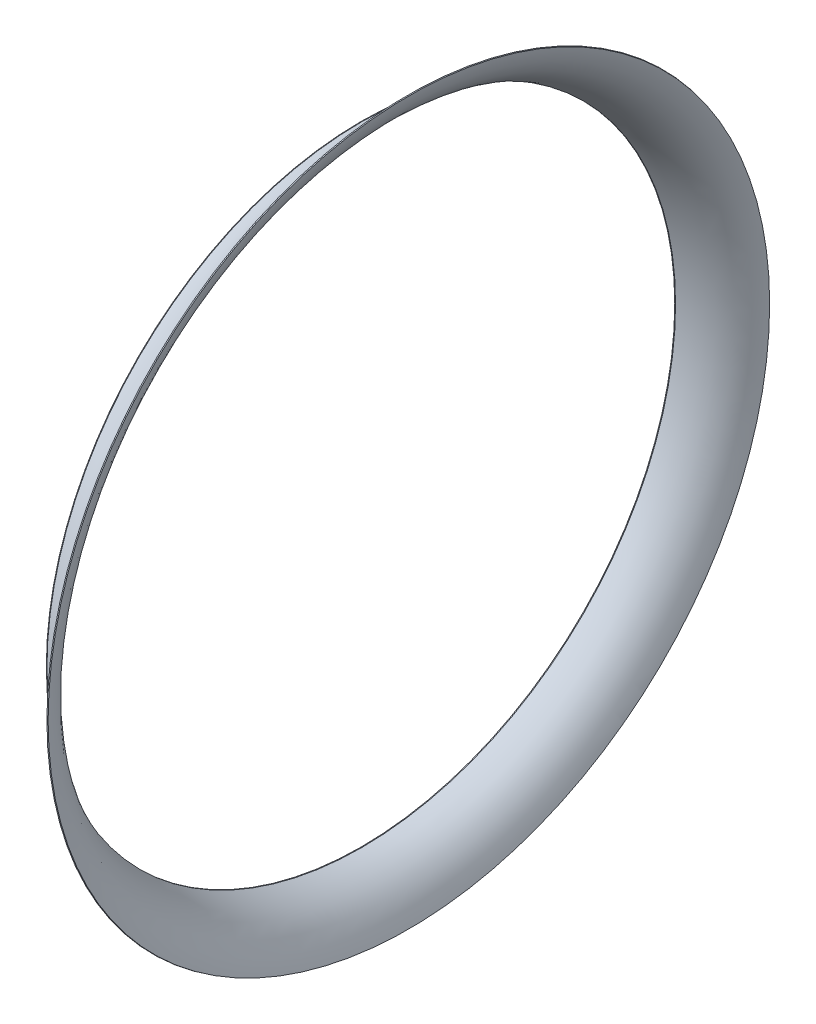
ISO-10303-21;
HEADER;
FILE_DESCRIPTION(('STEP AP214'),'2;1');
FILE_NAME('part.step','',(''),(''),'','','');
FILE_SCHEMA(('AUTOMOTIVE_DESIGN { 1 0 10303 214 1 1 1 1 }'));
ENDSEC;
DATA;
#1=APPLICATION_CONTEXT('core data for automotive mechanical design processes');
#2=APPLICATION_PROTOCOL_DEFINITION('international standard','automotive_design',2000,#1);
#3=PRODUCT_CONTEXT('',#1,'mechanical');
#4=PRODUCT('Part','Part','',(#3));
#5=PRODUCT_RELATED_PRODUCT_CATEGORY('part','',(#4));
#6=PRODUCT_DEFINITION_FORMATION('','',#4);
#7=PRODUCT_DEFINITION_CONTEXT('part definition',#1,'design');
#8=PRODUCT_DEFINITION('design','',#6,#7);
#9=PRODUCT_DEFINITION_SHAPE('','',#8);
#10=(LENGTH_UNIT() NAMED_UNIT(*) SI_UNIT(.MILLI.,.METRE.));
#11=(NAMED_UNIT(*) PLANE_ANGLE_UNIT() SI_UNIT($,.RADIAN.));
#12=(NAMED_UNIT(*) SI_UNIT($,.STERADIAN.) SOLID_ANGLE_UNIT());
#13=UNCERTAINTY_MEASURE_WITH_UNIT(LENGTH_MEASURE(1.E-05),#10,'distance_accuracy_value','');
#14=(GEOMETRIC_REPRESENTATION_CONTEXT(3) GLOBAL_UNCERTAINTY_ASSIGNED_CONTEXT((#13)) GLOBAL_UNIT_ASSIGNED_CONTEXT((#10,
#11,#12)) REPRESENTATION_CONTEXT('',''));
#15=CARTESIAN_POINT('',(0.,0.,0.));
#16=DIRECTION('',(0.,0.,1.));
#17=DIRECTION('',(1.,0.,0.));
#18=AXIS2_PLACEMENT_3D('',#15,#16,#17);
#19=CARTESIAN_POINT('',(-1.58131713034826,800.,0.));
#20=CARTESIAN_POINT('',(94.7858818546791,831.238620141468,0.));
#21=CARTESIAN_POINT('',(118.418682869652,920.,0.));
#22=B_SPLINE_CURVE_WITH_KNOTS('',2,(#19,#20,#21),.UNSPECIFIED.,.F.,.F.,(3,3),(0.,1.),.UNSPECIFIED.);
#23=CARTESIAN_POINT('',(-681.643835616438,0.,0.));
#24=DIRECTION('',(-1.,0.,0.));
#25=AXIS1_PLACEMENT('',#23,#24);
#26=SURFACE_OF_REVOLUTION('',#22,#25);
#27=CARTESIAN_POINT('',(118.418682869652,0.,0.));
#28=DIRECTION('',(-1.,0.,0.));
#29=DIRECTION('',(0.,0.,1.));
#30=AXIS2_PLACEMENT_3D('',#27,#28,#29);
#31=CIRCLE('',#30,920.);
#32=CARTESIAN_POINT('',(118.418682869652,0.,920.));
#33=VERTEX_POINT('',#32);
#34=EDGE_CURVE('E57',#33,#33,#31,.T.);
#35=ORIENTED_EDGE('',*,*,#34,.F.);
#36=EDGE_LOOP('',(#35));
#37=FACE_BOUND('',#36,.T.);
#38=CARTESIAN_POINT('',(-1.58131713034826,0.,0.));
#39=DIRECTION('',(-1.,0.,0.));
#40=DIRECTION('',(0.,0.,1.));
#41=AXIS2_PLACEMENT_3D('',#38,#39,#40);
#42=CIRCLE('',#41,800.);
#43=CARTESIAN_POINT('',(-1.58131713034826,0.,800.));
#44=VERTEX_POINT('',#43);
#45=EDGE_CURVE('E10',#44,#44,#42,.T.);
#46=ORIENTED_EDGE('',*,*,#45,.T.);
#47=EDGE_LOOP('',(#46));
#48=FACE_BOUND('',#47,.T.);
#49=ADVANCED_FACE('F34',(#37,#48),#26,.T.);
#50=CARTESIAN_POINT('',(-681.643835616438,0.,0.));
#51=DIRECTION('',(-1.,0.,0.));
#52=DIRECTION('',(0.,0.,1.));
#53=AXIS2_PLACEMENT_3D('',#50,#51,#52);
#54=CYLINDRICAL_SURFACE('',#53,800.);
#55=ORIENTED_EDGE('',*,*,#45,.F.);
#56=EDGE_LOOP('',(#55));
#57=FACE_BOUND('',#56,.T.);
#58=CARTESIAN_POINT('',(-3.58131713034826,0.,0.));
#59=DIRECTION('',(-1.,0.,0.));
#60=DIRECTION('',(0.,0.,1.));
#61=AXIS2_PLACEMENT_3D('',#58,#59,#60);
#62=CIRCLE('',#61,800.);
#63=CARTESIAN_POINT('',(-3.58131713034826,0.,800.));
#64=VERTEX_POINT('',#63);
#65=EDGE_CURVE('E41',#64,#64,#62,.T.);
#66=ORIENTED_EDGE('',*,*,#65,.T.);
#67=EDGE_LOOP('',(#66));
#68=FACE_BOUND('',#67,.T.);
#69=ADVANCED_FACE('F82',(#57,#68),#54,.F.);
#70=CARTESIAN_POINT('',(-3.58131713034826,800.,0.));
#71=DIRECTION('',(-1.,0.,0.));
#72=DIRECTION('',(0.,0.,1.));
#73=AXIS2_PLACEMENT_3D('',#70,#71,#72);
#74=PLANE('',#73);
#75=CARTESIAN_POINT('',(-3.58131713034826,0.,0.));
#76=DIRECTION('',(-1.,0.,0.));
#77=DIRECTION('',(0.,0.,1.));
#78=AXIS2_PLACEMENT_3D('',#75,#76,#77);
#79=CIRCLE('',#78,802.5);
#80=CARTESIAN_POINT('',(-3.58131713034826,0.,802.5));
#81=VERTEX_POINT('',#80);
#82=EDGE_CURVE('E45',#81,#81,#79,.T.);
#83=ORIENTED_EDGE('',*,*,#82,.T.);
#84=EDGE_LOOP('',(#83));
#85=FACE_BOUND('',#84,.T.);
#86=ORIENTED_EDGE('',*,*,#65,.F.);
#87=EDGE_LOOP('',(#86));
#88=FACE_BOUND('',#87,.T.);
#89=ADVANCED_FACE('F79',(#85,#88),#74,.T.);
#90=CARTESIAN_POINT('',(-681.643835616438,0.,0.));
#91=DIRECTION('',(-1.,0.,0.));
#92=DIRECTION('',(0.,0.,1.));
#93=AXIS2_PLACEMENT_3D('',#90,#91,#92);
#94=CYLINDRICAL_SURFACE('',#93,802.5);
#95=CARTESIAN_POINT('',(-1.97735723546888,0.,0.));
#96=DIRECTION('',(-1.,0.,0.));
#97=DIRECTION('',(0.,0.,1.));
#98=AXIS2_PLACEMENT_3D('',#95,#96,#97);
#99=CIRCLE('',#98,802.5);
#100=CARTESIAN_POINT('',(-1.97735723546888,0.,802.5));
#101=VERTEX_POINT('',#100);
#102=EDGE_CURVE('E49',#101,#101,#99,.T.);
#103=ORIENTED_EDGE('',*,*,#102,.T.);
#104=EDGE_LOOP('',(#103));
#105=FACE_BOUND('',#104,.T.);
#106=ORIENTED_EDGE('',*,*,#82,.F.);
#107=EDGE_LOOP('',(#106));
#108=FACE_BOUND('',#107,.T.);
#109=ADVANCED_FACE('F75',(#105,#108),#94,.T.);
#110=CARTESIAN_POINT('',(-1.97735723546897,802.5,0.));
#111=CARTESIAN_POINT('',(13.8776537807366,807.665855888917,0.));
#112=CARTESIAN_POINT('',(28.207878629323,814.004514737525,0.));
#113=CARTESIAN_POINT('',(53.8395236816454,829.008673232107,0.));
#114=CARTESIAN_POINT('',(65.1414553254975,837.673193918298,0.));
#115=CARTESIAN_POINT('',(84.7594613352606,857.333093415273,0.));
#116=CARTESIAN_POINT('',(93.0770692259665,868.329020116708,0.));
#117=CARTESIAN_POINT('',(106.758090028422,892.694123554181,0.));
#118=CARTESIAN_POINT('',(112.121339618107,906.064844057163,0.));
#119=CARTESIAN_POINT('',(116.002845663776,920.643218932175,0.));
#120=B_SPLINE_CURVE_WITH_KNOTS('',3,(#110,#111,#112,#113,#114,#115,#116,#117,#118,#119),
.UNSPECIFIED.,.F.,.F.,(4,2,2,2,4),(0.,0.25,0.5,0.75,1.),.UNSPECIFIED.);
#121=CARTESIAN_POINT('',(-681.643835616438,0.,0.));
#122=DIRECTION('',(-1.,0.,0.));
#123=AXIS1_PLACEMENT('',#121,#122);
#124=SURFACE_OF_REVOLUTION('',#120,#123);
#125=CARTESIAN_POINT('',(116.002845663776,0.,0.));
#126=DIRECTION('',(-1.,0.,0.));
#127=DIRECTION('',(0.,0.,1.));
#128=AXIS2_PLACEMENT_3D('',#125,#126,#127);
#129=CIRCLE('',#128,920.643218932175);
#130=CARTESIAN_POINT('',(116.002845663776,0.,920.643218932175));
#131=VERTEX_POINT('',#130);
#132=EDGE_CURVE('E54',#131,#131,#129,.T.);
#133=ORIENTED_EDGE('',*,*,#132,.T.);
#134=EDGE_LOOP('',(#133));
#135=FACE_BOUND('',#134,.T.);
#136=ORIENTED_EDGE('',*,*,#102,.F.);
#137=EDGE_LOOP('',(#136));
#138=FACE_BOUND('',#137,.T.);
#139=ADVANCED_FACE('F70',(#135,#138),#124,.F.);
#140=CARTESIAN_POINT('',(116.002845663776,0.,0.));
#141=DIRECTION('',(-1.,0.,0.));
#142=DIRECTION('',(0.,0.,1.));
#143=AXIS2_PLACEMENT_3D('',#140,#141,#142);
#144=CONICAL_SURFACE('',#143,920.643218932175,0.260214227054687);
#145=ORIENTED_EDGE('',*,*,#34,.T.);
#146=EDGE_LOOP('',(#145));
#147=FACE_BOUND('',#146,.T.);
#148=ORIENTED_EDGE('',*,*,#132,.F.);
#149=EDGE_LOOP('',(#148));
#150=FACE_BOUND('',#149,.T.);
#151=ADVANCED_FACE('F74',(#147,#150),#144,.T.);
#152=CLOSED_SHELL('',(#49,#69,#89,#109,#139,#151));
#153=MANIFOLD_SOLID_BREP('B2',#152);
#154=ADVANCED_BREP_SHAPE_REPRESENTATION('',(#18,#153),#14);
#155=SHAPE_DEFINITION_REPRESENTATION(#9,#154);
ENDSEC;
END-ISO-10303-21;
